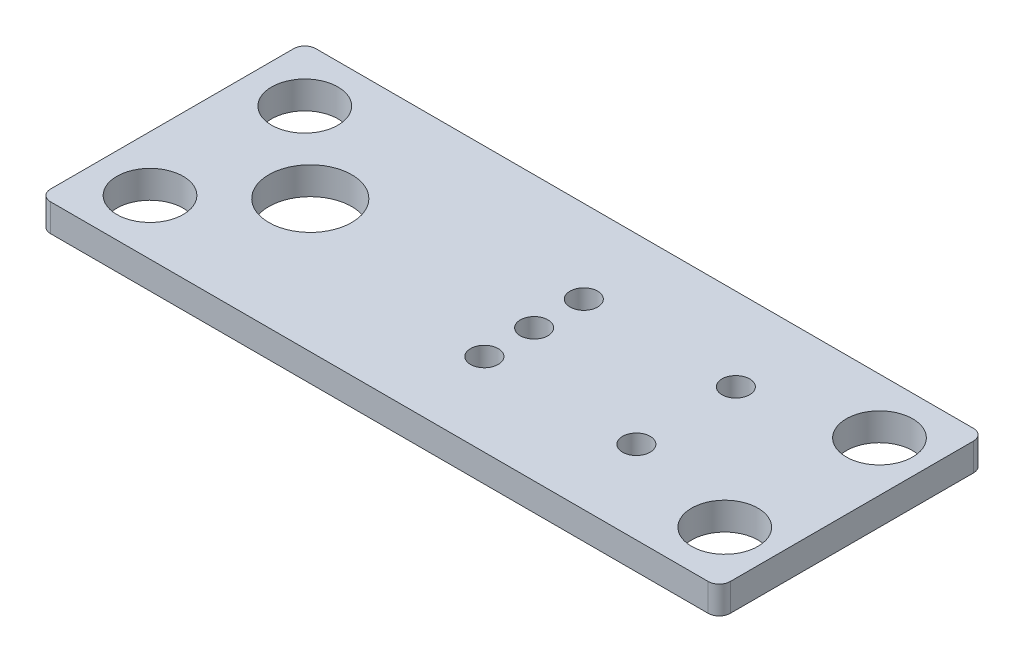
ISO-10303-21;
HEADER;
FILE_DESCRIPTION(('STEP AP214'),'2;1');
FILE_NAME('part.step','',(''),(''),'','','');
FILE_SCHEMA(('AUTOMOTIVE_DESIGN { 1 0 10303 214 1 1 1 1 }'));
ENDSEC;
DATA;
#1=APPLICATION_CONTEXT('core data for automotive mechanical design processes');
#2=APPLICATION_PROTOCOL_DEFINITION('international standard','automotive_design',2000,#1);
#3=PRODUCT_CONTEXT('',#1,'mechanical');
#4=PRODUCT('Part','Part','',(#3));
#5=PRODUCT_RELATED_PRODUCT_CATEGORY('part','',(#4));
#6=PRODUCT_DEFINITION_FORMATION('','',#4);
#7=PRODUCT_DEFINITION_CONTEXT('part definition',#1,'design');
#8=PRODUCT_DEFINITION('design','',#6,#7);
#9=PRODUCT_DEFINITION_SHAPE('','',#8);
#10=(LENGTH_UNIT() NAMED_UNIT(*) SI_UNIT(.MILLI.,.METRE.));
#11=(NAMED_UNIT(*) PLANE_ANGLE_UNIT() SI_UNIT($,.RADIAN.));
#12=(NAMED_UNIT(*) SI_UNIT($,.STERADIAN.) SOLID_ANGLE_UNIT());
#13=UNCERTAINTY_MEASURE_WITH_UNIT(LENGTH_MEASURE(1.E-05),#10,'distance_accuracy_value','');
#14=(GEOMETRIC_REPRESENTATION_CONTEXT(3) GLOBAL_UNCERTAINTY_ASSIGNED_CONTEXT((#13)) GLOBAL_UNIT_ASSIGNED_CONTEXT((#10,
#11,#12)) REPRESENTATION_CONTEXT('',''));
#15=CARTESIAN_POINT('',(0.,0.,0.));
#16=DIRECTION('',(0.,0.,1.));
#17=DIRECTION('',(1.,0.,0.));
#18=AXIS2_PLACEMENT_3D('',#15,#16,#17);
#19=CARTESIAN_POINT('',(0.,5.,0.));
#20=DIRECTION('',(0.,-1.,0.));
#21=DIRECTION('',(0.,0.,-1.));
#22=AXIS2_PLACEMENT_3D('',#19,#20,#21);
#23=PLANE('',#22);
#24=DIRECTION('',(0.,0.,-1.));
#25=VECTOR('',#24,1.);
#26=CARTESIAN_POINT('',(123.,5.,0.));
#27=LINE('',#26,#25);
#28=CARTESIAN_POINT('',(123.,5.,-2.));
#29=VERTEX_POINT('',#28);
#30=CARTESIAN_POINT('',(123.,5.,-46.));
#31=VERTEX_POINT('',#30);
#32=EDGE_CURVE('E171',#29,#31,#27,.T.);
#33=ORIENTED_EDGE('',*,*,#32,.T.);
#34=CARTESIAN_POINT('',(121.,5.,-46.));
#35=DIRECTION('',(0.,-1.,0.));
#36=DIRECTION('',(0.,0.,-1.));
#37=AXIS2_PLACEMENT_3D('',#34,#35,#36);
#38=CIRCLE('',#37,2.);
#39=CARTESIAN_POINT('',(121.,5.,-48.));
#40=VERTEX_POINT('',#39);
#41=EDGE_CURVE('E148',#31,#40,#38,.F.);
#42=ORIENTED_EDGE('',*,*,#41,.T.);
#43=DIRECTION('',(-1.,0.,0.));
#44=VECTOR('',#43,1.);
#45=CARTESIAN_POINT('',(0.,5.,-48.));
#46=LINE('',#45,#44);
#47=CARTESIAN_POINT('',(2.,5.,-48.));
#48=VERTEX_POINT('',#47);
#49=EDGE_CURVE('E119',#40,#48,#46,.T.);
#50=ORIENTED_EDGE('',*,*,#49,.T.);
#51=CARTESIAN_POINT('',(2.,5.,-46.));
#52=DIRECTION('',(0.,-1.,0.));
#53=DIRECTION('',(0.,0.,-1.));
#54=AXIS2_PLACEMENT_3D('',#51,#52,#53);
#55=CIRCLE('',#54,2.);
#56=CARTESIAN_POINT('',(0.,5.,-46.));
#57=VERTEX_POINT('',#56);
#58=EDGE_CURVE('E143',#48,#57,#55,.F.);
#59=ORIENTED_EDGE('',*,*,#58,.T.);
#60=DIRECTION('',(0.,0.,1.));
#61=VECTOR('',#60,1.);
#62=CARTESIAN_POINT('',(0.,5.,0.));
#63=LINE('',#62,#61);
#64=CARTESIAN_POINT('',(0.,5.,-2.));
#65=VERTEX_POINT('',#64);
#66=EDGE_CURVE('E126',#57,#65,#63,.T.);
#67=ORIENTED_EDGE('',*,*,#66,.T.);
#68=CARTESIAN_POINT('',(2.,5.,-2.));
#69=DIRECTION('',(0.,-1.,0.));
#70=DIRECTION('',(0.,0.,-1.));
#71=AXIS2_PLACEMENT_3D('',#68,#69,#70);
#72=CIRCLE('',#71,2.);
#73=CARTESIAN_POINT('',(2.,5.,0.));
#74=VERTEX_POINT('',#73);
#75=EDGE_CURVE('E55',#65,#74,#72,.F.);
#76=ORIENTED_EDGE('',*,*,#75,.T.);
#77=DIRECTION('',(1.,0.,0.));
#78=VECTOR('',#77,1.);
#79=CARTESIAN_POINT('',(0.,5.,0.));
#80=LINE('',#79,#78);
#81=CARTESIAN_POINT('',(121.,5.,0.));
#82=VERTEX_POINT('',#81);
#83=EDGE_CURVE('E129',#74,#82,#80,.T.);
#84=ORIENTED_EDGE('',*,*,#83,.T.);
#85=CARTESIAN_POINT('',(121.,5.,-2.));
#86=DIRECTION('',(0.,-1.,0.));
#87=DIRECTION('',(0.,0.,-1.));
#88=AXIS2_PLACEMENT_3D('',#85,#86,#87);
#89=CIRCLE('',#88,2.);
#90=EDGE_CURVE('E146',#82,#29,#89,.F.);
#91=ORIENTED_EDGE('',*,*,#90,.T.);
#92=EDGE_LOOP('',(#33,#42,#50,#59,#67,#76,#84,#91));
#93=FACE_BOUND('',#92,.T.);
#94=CARTESIAN_POINT('',(10.,5.,-10.));
#95=DIRECTION('',(0.,1.,0.));
#96=DIRECTION('',(0.,0.,1.));
#97=AXIS2_PLACEMENT_3D('',#94,#95,#96);
#98=CIRCLE('',#97,6.);
#99=CARTESIAN_POINT('',(10.,5.,-4.));
#100=VERTEX_POINT('',#99);
#101=EDGE_CURVE('E164',#100,#100,#98,.T.);
#102=ORIENTED_EDGE('',*,*,#101,.F.);
#103=EDGE_LOOP('',(#102));
#104=FACE_BOUND('',#103,.T.);
#105=CARTESIAN_POINT('',(10.,5.,-38.));
#106=DIRECTION('',(0.,1.,0.));
#107=DIRECTION('',(0.,0.,1.));
#108=AXIS2_PLACEMENT_3D('',#105,#106,#107);
#109=CIRCLE('',#108,6.);
#110=CARTESIAN_POINT('',(10.,5.,-32.));
#111=VERTEX_POINT('',#110);
#112=EDGE_CURVE('E176',#111,#111,#109,.T.);
#113=ORIENTED_EDGE('',*,*,#112,.F.);
#114=EDGE_LOOP('',(#113));
#115=FACE_BOUND('',#114,.T.);
#116=CARTESIAN_POINT('',(114.,5.,-38.));
#117=DIRECTION('',(0.,1.,0.));
#118=DIRECTION('',(0.,0.,1.));
#119=AXIS2_PLACEMENT_3D('',#116,#117,#118);
#120=CIRCLE('',#119,6.);
#121=CARTESIAN_POINT('',(114.,5.,-32.));
#122=VERTEX_POINT('',#121);
#123=EDGE_CURVE('E181',#122,#122,#120,.T.);
#124=ORIENTED_EDGE('',*,*,#123,.F.);
#125=EDGE_LOOP('',(#124));
#126=FACE_BOUND('',#125,.T.);
#127=CARTESIAN_POINT('',(114.,5.,-10.));
#128=DIRECTION('',(0.,1.,0.));
#129=DIRECTION('',(0.,0.,1.));
#130=AXIS2_PLACEMENT_3D('',#127,#128,#129);
#131=CIRCLE('',#130,6.);
#132=CARTESIAN_POINT('',(114.,5.,-4.));
#133=VERTEX_POINT('',#132);
#134=EDGE_CURVE('E187',#133,#133,#131,.T.);
#135=ORIENTED_EDGE('',*,*,#134,.F.);
#136=EDGE_LOOP('',(#135));
#137=FACE_BOUND('',#136,.T.);
#138=CARTESIAN_POINT('',(25.,5.,-24.));
#139=DIRECTION('',(0.,1.,0.));
#140=DIRECTION('',(0.,0.,1.));
#141=AXIS2_PLACEMENT_3D('',#138,#139,#140);
#142=CIRCLE('',#141,7.5);
#143=CARTESIAN_POINT('',(25.,5.,-16.5));
#144=VERTEX_POINT('',#143);
#145=EDGE_CURVE('E193',#144,#144,#142,.T.);
#146=ORIENTED_EDGE('',*,*,#145,.F.);
#147=EDGE_LOOP('',(#146));
#148=FACE_BOUND('',#147,.T.);
#149=CARTESIAN_POINT('',(93.,5.,-15.));
#150=DIRECTION('',(0.,1.,0.));
#151=DIRECTION('',(0.,0.,1.));
#152=AXIS2_PLACEMENT_3D('',#149,#150,#151);
#153=CIRCLE('',#152,2.50000000000001);
#154=CARTESIAN_POINT('',(93.,5.,-12.5));
#155=VERTEX_POINT('',#154);
#156=EDGE_CURVE('E199',#155,#155,#153,.T.);
#157=ORIENTED_EDGE('',*,*,#156,.F.);
#158=EDGE_LOOP('',(#157));
#159=FACE_BOUND('',#158,.T.);
#160=CARTESIAN_POINT('',(93.,5.,-33.));
#161=DIRECTION('',(0.,1.,0.));
#162=DIRECTION('',(0.,0.,1.));
#163=AXIS2_PLACEMENT_3D('',#160,#161,#162);
#164=CIRCLE('',#163,2.50000000000001);
#165=CARTESIAN_POINT('',(93.,5.,-30.5));
#166=VERTEX_POINT('',#165);
#167=EDGE_CURVE('E205',#166,#166,#164,.T.);
#168=ORIENTED_EDGE('',*,*,#167,.F.);
#169=EDGE_LOOP('',(#168));
#170=FACE_BOUND('',#169,.T.);
#171=CARTESIAN_POINT('',(65.5,5.,-15.));
#172=DIRECTION('',(0.,1.,0.));
#173=DIRECTION('',(0.,0.,1.));
#174=AXIS2_PLACEMENT_3D('',#171,#172,#173);
#175=CIRCLE('',#174,2.50000000000001);
#176=CARTESIAN_POINT('',(65.5,5.,-12.5));
#177=VERTEX_POINT('',#176);
#178=EDGE_CURVE('E211',#177,#177,#175,.T.);
#179=ORIENTED_EDGE('',*,*,#178,.F.);
#180=EDGE_LOOP('',(#179));
#181=FACE_BOUND('',#180,.T.);
#182=CARTESIAN_POINT('',(65.5,5.,-24.));
#183=DIRECTION('',(0.,1.,0.));
#184=DIRECTION('',(0.,0.,1.));
#185=AXIS2_PLACEMENT_3D('',#182,#183,#184);
#186=CIRCLE('',#185,2.50000000000001);
#187=CARTESIAN_POINT('',(65.5,5.,-21.5));
#188=VERTEX_POINT('',#187);
#189=EDGE_CURVE('E217',#188,#188,#186,.T.);
#190=ORIENTED_EDGE('',*,*,#189,.F.);
#191=EDGE_LOOP('',(#190));
#192=FACE_BOUND('',#191,.T.);
#193=CARTESIAN_POINT('',(65.5,5.,-33.));
#194=DIRECTION('',(0.,1.,0.));
#195=DIRECTION('',(0.,0.,1.));
#196=AXIS2_PLACEMENT_3D('',#193,#194,#195);
#197=CIRCLE('',#196,2.50000000000001);
#198=CARTESIAN_POINT('',(65.5,5.,-30.5));
#199=VERTEX_POINT('',#198);
#200=EDGE_CURVE('E223',#199,#199,#197,.T.);
#201=ORIENTED_EDGE('',*,*,#200,.F.);
#202=EDGE_LOOP('',(#201));
#203=FACE_BOUND('',#202,.T.);
#204=ADVANCED_FACE('F33',(#93,#104,#115,#126,#137,#148,#159,#170,#181,#192,#203),#23,.F.);
#205=CARTESIAN_POINT('',(0.,0.,0.));
#206=DIRECTION('',(0.,-1.,0.));
#207=DIRECTION('',(0.,0.,-1.));
#208=AXIS2_PLACEMENT_3D('',#205,#206,#207);
#209=PLANE('',#208);
#210=CARTESIAN_POINT('',(65.5,0.,-24.));
#211=DIRECTION('',(0.,1.,0.));
#212=DIRECTION('',(0.,0.,1.));
#213=AXIS2_PLACEMENT_3D('',#210,#211,#212);
#214=CIRCLE('',#213,2.50000000000001);
#215=CARTESIAN_POINT('',(65.5,0.,-21.5));
#216=VERTEX_POINT('',#215);
#217=EDGE_CURVE('E220',#216,#216,#214,.T.);
#218=ORIENTED_EDGE('',*,*,#217,.T.);
#219=EDGE_LOOP('',(#218));
#220=FACE_BOUND('',#219,.T.);
#221=CARTESIAN_POINT('',(93.,0.,-33.));
#222=DIRECTION('',(0.,1.,0.));
#223=DIRECTION('',(0.,0.,1.));
#224=AXIS2_PLACEMENT_3D('',#221,#222,#223);
#225=CIRCLE('',#224,2.50000000000001);
#226=CARTESIAN_POINT('',(93.,0.,-30.5));
#227=VERTEX_POINT('',#226);
#228=EDGE_CURVE('E208',#227,#227,#225,.T.);
#229=ORIENTED_EDGE('',*,*,#228,.T.);
#230=EDGE_LOOP('',(#229));
#231=FACE_BOUND('',#230,.T.);
#232=CARTESIAN_POINT('',(25.,0.,-24.));
#233=DIRECTION('',(0.,1.,0.));
#234=DIRECTION('',(0.,0.,1.));
#235=AXIS2_PLACEMENT_3D('',#232,#233,#234);
#236=CIRCLE('',#235,7.5);
#237=CARTESIAN_POINT('',(25.,0.,-16.5));
#238=VERTEX_POINT('',#237);
#239=EDGE_CURVE('E196',#238,#238,#236,.T.);
#240=ORIENTED_EDGE('',*,*,#239,.T.);
#241=EDGE_LOOP('',(#240));
#242=FACE_BOUND('',#241,.T.);
#243=CARTESIAN_POINT('',(114.,0.,-38.));
#244=DIRECTION('',(0.,1.,0.));
#245=DIRECTION('',(0.,0.,1.));
#246=AXIS2_PLACEMENT_3D('',#243,#244,#245);
#247=CIRCLE('',#246,6.);
#248=CARTESIAN_POINT('',(114.,0.,-32.));
#249=VERTEX_POINT('',#248);
#250=EDGE_CURVE('E184',#249,#249,#247,.T.);
#251=ORIENTED_EDGE('',*,*,#250,.T.);
#252=EDGE_LOOP('',(#251));
#253=FACE_BOUND('',#252,.T.);
#254=CARTESIAN_POINT('',(10.,0.,-10.));
#255=DIRECTION('',(0.,1.,0.));
#256=DIRECTION('',(0.,0.,1.));
#257=AXIS2_PLACEMENT_3D('',#254,#255,#256);
#258=CIRCLE('',#257,6.);
#259=CARTESIAN_POINT('',(10.,0.,-4.));
#260=VERTEX_POINT('',#259);
#261=EDGE_CURVE('E167',#260,#260,#258,.T.);
#262=ORIENTED_EDGE('',*,*,#261,.T.);
#263=EDGE_LOOP('',(#262));
#264=FACE_BOUND('',#263,.T.);
#265=DIRECTION('',(-1.,0.,0.));
#266=VECTOR('',#265,1.);
#267=CARTESIAN_POINT('',(0.,0.,-48.));
#268=LINE('',#267,#266);
#269=CARTESIAN_POINT('',(121.,0.,-48.));
#270=VERTEX_POINT('',#269);
#271=CARTESIAN_POINT('',(2.,0.,-48.));
#272=VERTEX_POINT('',#271);
#273=EDGE_CURVE('E116',#270,#272,#268,.T.);
#274=ORIENTED_EDGE('',*,*,#273,.F.);
#275=CARTESIAN_POINT('',(121.,0.,-46.));
#276=DIRECTION('',(0.,-1.,0.));
#277=DIRECTION('',(0.,0.,-1.));
#278=AXIS2_PLACEMENT_3D('',#275,#276,#277);
#279=CIRCLE('',#278,2.);
#280=CARTESIAN_POINT('',(123.,0.,-46.));
#281=VERTEX_POINT('',#280);
#282=EDGE_CURVE('E99',#270,#281,#279,.T.);
#283=ORIENTED_EDGE('',*,*,#282,.T.);
#284=DIRECTION('',(0.,0.,-1.));
#285=VECTOR('',#284,1.);
#286=CARTESIAN_POINT('',(123.,0.,0.));
#287=LINE('',#286,#285);
#288=CARTESIAN_POINT('',(123.,0.,-2.));
#289=VERTEX_POINT('',#288);
#290=EDGE_CURVE('E127',#289,#281,#287,.T.);
#291=ORIENTED_EDGE('',*,*,#290,.F.);
#292=CARTESIAN_POINT('',(121.,0.,-2.));
#293=DIRECTION('',(0.,-1.,0.));
#294=DIRECTION('',(0.,0.,-1.));
#295=AXIS2_PLACEMENT_3D('',#292,#293,#294);
#296=CIRCLE('',#295,2.);
#297=CARTESIAN_POINT('',(121.,0.,0.));
#298=VERTEX_POINT('',#297);
#299=EDGE_CURVE('E110',#289,#298,#296,.T.);
#300=ORIENTED_EDGE('',*,*,#299,.T.);
#301=DIRECTION('',(1.,0.,0.));
#302=VECTOR('',#301,1.);
#303=CARTESIAN_POINT('',(0.,0.,0.));
#304=LINE('',#303,#302);
#305=CARTESIAN_POINT('',(2.,0.,0.));
#306=VERTEX_POINT('',#305);
#307=EDGE_CURVE('E131',#306,#298,#304,.T.);
#308=ORIENTED_EDGE('',*,*,#307,.F.);
#309=CARTESIAN_POINT('',(2.,0.,-2.));
#310=DIRECTION('',(0.,-1.,0.));
#311=DIRECTION('',(0.,0.,-1.));
#312=AXIS2_PLACEMENT_3D('',#309,#310,#311);
#313=CIRCLE('',#312,2.);
#314=CARTESIAN_POINT('',(0.,0.,-2.));
#315=VERTEX_POINT('',#314);
#316=EDGE_CURVE('E137',#306,#315,#313,.T.);
#317=ORIENTED_EDGE('',*,*,#316,.T.);
#318=DIRECTION('',(0.,0.,1.));
#319=VECTOR('',#318,1.);
#320=CARTESIAN_POINT('',(0.,0.,0.));
#321=LINE('',#320,#319);
#322=CARTESIAN_POINT('',(0.,0.,-46.));
#323=VERTEX_POINT('',#322);
#324=EDGE_CURVE('E159',#323,#315,#321,.T.);
#325=ORIENTED_EDGE('',*,*,#324,.F.);
#326=CARTESIAN_POINT('',(2.,0.,-46.));
#327=DIRECTION('',(0.,-1.,0.));
#328=DIRECTION('',(0.,0.,-1.));
#329=AXIS2_PLACEMENT_3D('',#326,#327,#328);
#330=CIRCLE('',#329,2.);
#331=EDGE_CURVE('E120',#323,#272,#330,.T.);
#332=ORIENTED_EDGE('',*,*,#331,.T.);
#333=EDGE_LOOP('',(#274,#283,#291,#300,#308,#317,#325,#332));
#334=FACE_BOUND('',#333,.T.);
#335=CARTESIAN_POINT('',(10.,0.,-38.));
#336=DIRECTION('',(0.,1.,0.));
#337=DIRECTION('',(0.,0.,1.));
#338=AXIS2_PLACEMENT_3D('',#335,#336,#337);
#339=CIRCLE('',#338,6.);
#340=CARTESIAN_POINT('',(10.,0.,-32.));
#341=VERTEX_POINT('',#340);
#342=EDGE_CURVE('E178',#341,#341,#339,.T.);
#343=ORIENTED_EDGE('',*,*,#342,.T.);
#344=EDGE_LOOP('',(#343));
#345=FACE_BOUND('',#344,.T.);
#346=CARTESIAN_POINT('',(114.,0.,-10.));
#347=DIRECTION('',(0.,1.,0.));
#348=DIRECTION('',(0.,0.,1.));
#349=AXIS2_PLACEMENT_3D('',#346,#347,#348);
#350=CIRCLE('',#349,6.);
#351=CARTESIAN_POINT('',(114.,0.,-4.));
#352=VERTEX_POINT('',#351);
#353=EDGE_CURVE('E190',#352,#352,#350,.T.);
#354=ORIENTED_EDGE('',*,*,#353,.T.);
#355=EDGE_LOOP('',(#354));
#356=FACE_BOUND('',#355,.T.);
#357=CARTESIAN_POINT('',(93.,0.,-15.));
#358=DIRECTION('',(0.,1.,0.));
#359=DIRECTION('',(0.,0.,1.));
#360=AXIS2_PLACEMENT_3D('',#357,#358,#359);
#361=CIRCLE('',#360,2.50000000000001);
#362=CARTESIAN_POINT('',(93.,0.,-12.5));
#363=VERTEX_POINT('',#362);
#364=EDGE_CURVE('E202',#363,#363,#361,.T.);
#365=ORIENTED_EDGE('',*,*,#364,.T.);
#366=EDGE_LOOP('',(#365));
#367=FACE_BOUND('',#366,.T.);
#368=CARTESIAN_POINT('',(65.5,0.,-15.));
#369=DIRECTION('',(0.,1.,0.));
#370=DIRECTION('',(0.,0.,1.));
#371=AXIS2_PLACEMENT_3D('',#368,#369,#370);
#372=CIRCLE('',#371,2.50000000000001);
#373=CARTESIAN_POINT('',(65.5,0.,-12.5));
#374=VERTEX_POINT('',#373);
#375=EDGE_CURVE('E214',#374,#374,#372,.T.);
#376=ORIENTED_EDGE('',*,*,#375,.T.);
#377=EDGE_LOOP('',(#376));
#378=FACE_BOUND('',#377,.T.);
#379=CARTESIAN_POINT('',(65.5,0.,-33.));
#380=DIRECTION('',(0.,1.,0.));
#381=DIRECTION('',(0.,0.,1.));
#382=AXIS2_PLACEMENT_3D('',#379,#380,#381);
#383=CIRCLE('',#382,2.50000000000001);
#384=CARTESIAN_POINT('',(65.5,0.,-30.5));
#385=VERTEX_POINT('',#384);
#386=EDGE_CURVE('E226',#385,#385,#383,.T.);
#387=ORIENTED_EDGE('',*,*,#386,.T.);
#388=EDGE_LOOP('',(#387));
#389=FACE_BOUND('',#388,.T.);
#390=ADVANCED_FACE('F123',(#220,#231,#242,#253,#264,#334,#345,#356,#367,#378,#389),#209,.T.);
#391=CARTESIAN_POINT('',(0.,5.,0.));
#392=DIRECTION('',(1.,0.,0.));
#393=DIRECTION('',(0.,0.,-1.));
#394=AXIS2_PLACEMENT_3D('',#391,#392,#393);
#395=PLANE('',#394);
#396=ORIENTED_EDGE('',*,*,#324,.T.);
#397=DIRECTION('',(0.,-1.,0.));
#398=VECTOR('',#397,1.);
#399=CARTESIAN_POINT('',(0.,5.,-2.));
#400=LINE('',#399,#398);
#401=EDGE_CURVE('E11',#315,#65,#400,.F.);
#402=ORIENTED_EDGE('',*,*,#401,.T.);
#403=ORIENTED_EDGE('',*,*,#66,.F.);
#404=DIRECTION('',(0.,-1.,0.));
#405=VECTOR('',#404,1.);
#406=CARTESIAN_POINT('',(0.,5.,-46.));
#407=LINE('',#406,#405);
#408=EDGE_CURVE('E41',#57,#323,#407,.T.);
#409=ORIENTED_EDGE('',*,*,#408,.T.);
#410=EDGE_LOOP('',(#396,#402,#403,#409));
#411=FACE_BOUND('',#410,.T.);
#412=ADVANCED_FACE('F158',(#411),#395,.F.);
#413=CARTESIAN_POINT('',(0.,5.,0.));
#414=DIRECTION('',(0.,0.,-1.));
#415=DIRECTION('',(-1.,0.,0.));
#416=AXIS2_PLACEMENT_3D('',#413,#414,#415);
#417=PLANE('',#416);
#418=ORIENTED_EDGE('',*,*,#307,.T.);
#419=DIRECTION('',(0.,-1.,0.));
#420=VECTOR('',#419,1.);
#421=CARTESIAN_POINT('',(121.,5.,0.));
#422=LINE('',#421,#420);
#423=EDGE_CURVE('E48',#298,#82,#422,.F.);
#424=ORIENTED_EDGE('',*,*,#423,.T.);
#425=ORIENTED_EDGE('',*,*,#83,.F.);
#426=DIRECTION('',(0.,-1.,0.));
#427=VECTOR('',#426,1.);
#428=CARTESIAN_POINT('',(2.,5.,0.));
#429=LINE('',#428,#427);
#430=EDGE_CURVE('E150',#74,#306,#429,.T.);
#431=ORIENTED_EDGE('',*,*,#430,.T.);
#432=EDGE_LOOP('',(#418,#424,#425,#431));
#433=FACE_BOUND('',#432,.T.);
#434=ADVANCED_FACE('F253',(#433),#417,.F.);
#435=CARTESIAN_POINT('',(123.,5.,0.));
#436=DIRECTION('',(-1.,0.,0.));
#437=DIRECTION('',(0.,0.,1.));
#438=AXIS2_PLACEMENT_3D('',#435,#436,#437);
#439=PLANE('',#438);
#440=ORIENTED_EDGE('',*,*,#290,.T.);
#441=DIRECTION('',(0.,-1.,0.));
#442=VECTOR('',#441,1.);
#443=CARTESIAN_POINT('',(123.,5.,-46.));
#444=LINE('',#443,#442);
#445=EDGE_CURVE('E104',#281,#31,#444,.F.);
#446=ORIENTED_EDGE('',*,*,#445,.T.);
#447=ORIENTED_EDGE('',*,*,#32,.F.);
#448=DIRECTION('',(0.,-1.,0.));
#449=VECTOR('',#448,1.);
#450=CARTESIAN_POINT('',(123.,5.,-2.));
#451=LINE('',#450,#449);
#452=EDGE_CURVE('E109',#29,#289,#451,.T.);
#453=ORIENTED_EDGE('',*,*,#452,.T.);
#454=EDGE_LOOP('',(#440,#446,#447,#453));
#455=FACE_BOUND('',#454,.T.);
#456=ADVANCED_FACE('F250',(#455),#439,.F.);
#457=CARTESIAN_POINT('',(0.,5.,-48.));
#458=DIRECTION('',(0.,0.,1.));
#459=DIRECTION('',(1.,0.,0.));
#460=AXIS2_PLACEMENT_3D('',#457,#458,#459);
#461=PLANE('',#460);
#462=ORIENTED_EDGE('',*,*,#49,.F.);
#463=DIRECTION('',(0.,-1.,0.));
#464=VECTOR('',#463,1.);
#465=CARTESIAN_POINT('',(121.,5.,-48.));
#466=LINE('',#465,#464);
#467=EDGE_CURVE('E103',#40,#270,#466,.T.);
#468=ORIENTED_EDGE('',*,*,#467,.T.);
#469=ORIENTED_EDGE('',*,*,#273,.T.);
#470=DIRECTION('',(0.,-1.,0.));
#471=VECTOR('',#470,1.);
#472=CARTESIAN_POINT('',(2.,5.,-48.));
#473=LINE('',#472,#471);
#474=EDGE_CURVE('E121',#272,#48,#473,.F.);
#475=ORIENTED_EDGE('',*,*,#474,.T.);
#476=EDGE_LOOP('',(#462,#468,#469,#475));
#477=FACE_BOUND('',#476,.T.);
#478=ADVANCED_FACE('F115',(#477),#461,.F.);
#479=CARTESIAN_POINT('',(10.,5.,-10.));
#480=DIRECTION('',(0.,-1.,0.));
#481=DIRECTION('',(0.,0.,-1.));
#482=AXIS2_PLACEMENT_3D('',#479,#480,#481);
#483=CYLINDRICAL_SURFACE('',#482,6.);
#484=ORIENTED_EDGE('',*,*,#101,.T.);
#485=EDGE_LOOP('',(#484));
#486=FACE_BOUND('',#485,.T.);
#487=ORIENTED_EDGE('',*,*,#261,.F.);
#488=EDGE_LOOP('',(#487));
#489=FACE_BOUND('',#488,.T.);
#490=ADVANCED_FACE('F245',(#486,#489),#483,.F.);
#491=CARTESIAN_POINT('',(10.,5.,-38.));
#492=DIRECTION('',(0.,-1.,0.));
#493=DIRECTION('',(0.,0.,-1.));
#494=AXIS2_PLACEMENT_3D('',#491,#492,#493);
#495=CYLINDRICAL_SURFACE('',#494,6.);
#496=ORIENTED_EDGE('',*,*,#112,.T.);
#497=EDGE_LOOP('',(#496));
#498=FACE_BOUND('',#497,.T.);
#499=ORIENTED_EDGE('',*,*,#342,.F.);
#500=EDGE_LOOP('',(#499));
#501=FACE_BOUND('',#500,.T.);
#502=ADVANCED_FACE('F338',(#498,#501),#495,.F.);
#503=CARTESIAN_POINT('',(114.,5.,-38.));
#504=DIRECTION('',(0.,-1.,0.));
#505=DIRECTION('',(0.,0.,-1.));
#506=AXIS2_PLACEMENT_3D('',#503,#504,#505);
#507=CYLINDRICAL_SURFACE('',#506,6.);
#508=ORIENTED_EDGE('',*,*,#123,.T.);
#509=EDGE_LOOP('',(#508));
#510=FACE_BOUND('',#509,.T.);
#511=ORIENTED_EDGE('',*,*,#250,.F.);
#512=EDGE_LOOP('',(#511));
#513=FACE_BOUND('',#512,.T.);
#514=ADVANCED_FACE('F346',(#510,#513),#507,.F.);
#515=CARTESIAN_POINT('',(114.,5.,-10.));
#516=DIRECTION('',(0.,-1.,0.));
#517=DIRECTION('',(0.,0.,-1.));
#518=AXIS2_PLACEMENT_3D('',#515,#516,#517);
#519=CYLINDRICAL_SURFACE('',#518,6.);
#520=ORIENTED_EDGE('',*,*,#134,.T.);
#521=EDGE_LOOP('',(#520));
#522=FACE_BOUND('',#521,.T.);
#523=ORIENTED_EDGE('',*,*,#353,.F.);
#524=EDGE_LOOP('',(#523));
#525=FACE_BOUND('',#524,.T.);
#526=ADVANCED_FACE('F354',(#522,#525),#519,.F.);
#527=CARTESIAN_POINT('',(25.,5.,-24.));
#528=DIRECTION('',(0.,-1.,0.));
#529=DIRECTION('',(0.,0.,-1.));
#530=AXIS2_PLACEMENT_3D('',#527,#528,#529);
#531=CYLINDRICAL_SURFACE('',#530,7.5);
#532=ORIENTED_EDGE('',*,*,#145,.T.);
#533=EDGE_LOOP('',(#532));
#534=FACE_BOUND('',#533,.T.);
#535=ORIENTED_EDGE('',*,*,#239,.F.);
#536=EDGE_LOOP('',(#535));
#537=FACE_BOUND('',#536,.T.);
#538=ADVANCED_FACE('F363',(#534,#537),#531,.F.);
#539=CARTESIAN_POINT('',(93.,5.,-15.));
#540=DIRECTION('',(0.,-1.,0.));
#541=DIRECTION('',(0.,0.,-1.));
#542=AXIS2_PLACEMENT_3D('',#539,#540,#541);
#543=CYLINDRICAL_SURFACE('',#542,2.50000000000001);
#544=ORIENTED_EDGE('',*,*,#156,.T.);
#545=EDGE_LOOP('',(#544));
#546=FACE_BOUND('',#545,.T.);
#547=ORIENTED_EDGE('',*,*,#364,.F.);
#548=EDGE_LOOP('',(#547));
#549=FACE_BOUND('',#548,.T.);
#550=ADVANCED_FACE('F372',(#546,#549),#543,.F.);
#551=CARTESIAN_POINT('',(93.,5.,-33.));
#552=DIRECTION('',(0.,-1.,0.));
#553=DIRECTION('',(0.,0.,-1.));
#554=AXIS2_PLACEMENT_3D('',#551,#552,#553);
#555=CYLINDRICAL_SURFACE('',#554,2.50000000000001);
#556=ORIENTED_EDGE('',*,*,#167,.T.);
#557=EDGE_LOOP('',(#556));
#558=FACE_BOUND('',#557,.T.);
#559=ORIENTED_EDGE('',*,*,#228,.F.);
#560=EDGE_LOOP('',(#559));
#561=FACE_BOUND('',#560,.T.);
#562=ADVANCED_FACE('F381',(#558,#561),#555,.F.);
#563=CARTESIAN_POINT('',(65.5,5.,-15.));
#564=DIRECTION('',(0.,-1.,0.));
#565=DIRECTION('',(0.,0.,-1.));
#566=AXIS2_PLACEMENT_3D('',#563,#564,#565);
#567=CYLINDRICAL_SURFACE('',#566,2.50000000000001);
#568=ORIENTED_EDGE('',*,*,#178,.T.);
#569=EDGE_LOOP('',(#568));
#570=FACE_BOUND('',#569,.T.);
#571=ORIENTED_EDGE('',*,*,#375,.F.);
#572=EDGE_LOOP('',(#571));
#573=FACE_BOUND('',#572,.T.);
#574=ADVANCED_FACE('F390',(#570,#573),#567,.F.);
#575=CARTESIAN_POINT('',(65.5,5.,-24.));
#576=DIRECTION('',(0.,-1.,0.));
#577=DIRECTION('',(0.,0.,-1.));
#578=AXIS2_PLACEMENT_3D('',#575,#576,#577);
#579=CYLINDRICAL_SURFACE('',#578,2.50000000000001);
#580=ORIENTED_EDGE('',*,*,#189,.T.);
#581=EDGE_LOOP('',(#580));
#582=FACE_BOUND('',#581,.T.);
#583=ORIENTED_EDGE('',*,*,#217,.F.);
#584=EDGE_LOOP('',(#583));
#585=FACE_BOUND('',#584,.T.);
#586=ADVANCED_FACE('F399',(#582,#585),#579,.F.);
#587=CARTESIAN_POINT('',(65.5,5.,-33.));
#588=DIRECTION('',(0.,-1.,0.));
#589=DIRECTION('',(0.,0.,-1.));
#590=AXIS2_PLACEMENT_3D('',#587,#588,#589);
#591=CYLINDRICAL_SURFACE('',#590,2.50000000000001);
#592=ORIENTED_EDGE('',*,*,#200,.T.);
#593=EDGE_LOOP('',(#592));
#594=FACE_BOUND('',#593,.T.);
#595=ORIENTED_EDGE('',*,*,#386,.F.);
#596=EDGE_LOOP('',(#595));
#597=FACE_BOUND('',#596,.T.);
#598=ADVANCED_FACE('F232',(#594,#597),#591,.F.);
#599=CARTESIAN_POINT('',(121.,5.,-46.));
#600=DIRECTION('',(0.,-1.,0.));
#601=DIRECTION('',(0.,0.,-1.));
#602=AXIS2_PLACEMENT_3D('',#599,#600,#601);
#603=CYLINDRICAL_SURFACE('',#602,2.);
#604=ORIENTED_EDGE('',*,*,#41,.F.);
#605=ORIENTED_EDGE('',*,*,#445,.F.);
#606=ORIENTED_EDGE('',*,*,#282,.F.);
#607=ORIENTED_EDGE('',*,*,#467,.F.);
#608=EDGE_LOOP('',(#604,#605,#606,#607));
#609=FACE_BOUND('',#608,.T.);
#610=ADVANCED_FACE('F102',(#609),#603,.T.);
#611=CARTESIAN_POINT('',(121.,5.,-2.));
#612=DIRECTION('',(0.,-1.,0.));
#613=DIRECTION('',(0.,0.,-1.));
#614=AXIS2_PLACEMENT_3D('',#611,#612,#613);
#615=CYLINDRICAL_SURFACE('',#614,2.);
#616=ORIENTED_EDGE('',*,*,#90,.F.);
#617=ORIENTED_EDGE('',*,*,#423,.F.);
#618=ORIENTED_EDGE('',*,*,#299,.F.);
#619=ORIENTED_EDGE('',*,*,#452,.F.);
#620=EDGE_LOOP('',(#616,#617,#618,#619));
#621=FACE_BOUND('',#620,.T.);
#622=ADVANCED_FACE('F261',(#621),#615,.T.);
#623=CARTESIAN_POINT('',(2.,5.,-2.));
#624=DIRECTION('',(0.,-1.,0.));
#625=DIRECTION('',(0.,0.,-1.));
#626=AXIS2_PLACEMENT_3D('',#623,#624,#625);
#627=CYLINDRICAL_SURFACE('',#626,2.);
#628=ORIENTED_EDGE('',*,*,#75,.F.);
#629=ORIENTED_EDGE('',*,*,#401,.F.);
#630=ORIENTED_EDGE('',*,*,#316,.F.);
#631=ORIENTED_EDGE('',*,*,#430,.F.);
#632=EDGE_LOOP('',(#628,#629,#630,#631));
#633=FACE_BOUND('',#632,.T.);
#634=ADVANCED_FACE('F263',(#633),#627,.T.);
#635=CARTESIAN_POINT('',(2.,5.,-46.));
#636=DIRECTION('',(0.,-1.,0.));
#637=DIRECTION('',(0.,0.,-1.));
#638=AXIS2_PLACEMENT_3D('',#635,#636,#637);
#639=CYLINDRICAL_SURFACE('',#638,2.);
#640=ORIENTED_EDGE('',*,*,#58,.F.);
#641=ORIENTED_EDGE('',*,*,#474,.F.);
#642=ORIENTED_EDGE('',*,*,#331,.F.);
#643=ORIENTED_EDGE('',*,*,#408,.F.);
#644=EDGE_LOOP('',(#640,#641,#642,#643));
#645=FACE_BOUND('',#644,.T.);
#646=ADVANCED_FACE('F35',(#645),#639,.T.);
#647=CLOSED_SHELL('',(#204,#390,#412,#434,#456,#478,#490,#502,#514,#526,#538,#550,#562,#574,
#586,#598,#610,#622,#634,#646));
#648=MANIFOLD_SOLID_BREP('B2',#647);
#649=ADVANCED_BREP_SHAPE_REPRESENTATION('',(#18,#648),#14);
#650=SHAPE_DEFINITION_REPRESENTATION(#9,#649);
ENDSEC;
END-ISO-10303-21;
